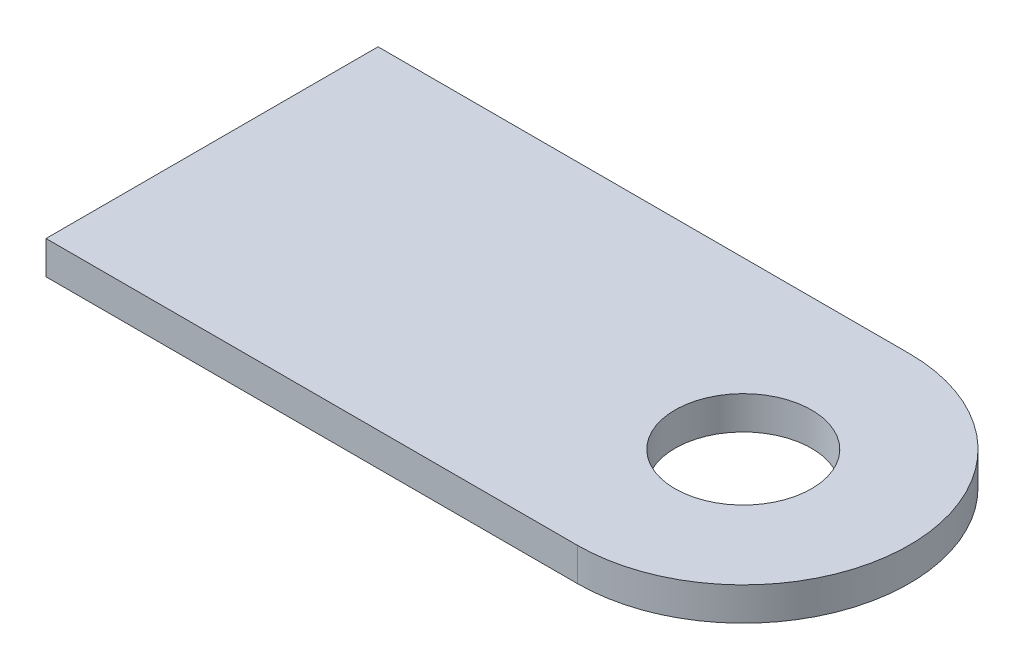
ISO-10303-21;
HEADER;
FILE_DESCRIPTION(('STEP AP214'),'2;1');
FILE_NAME('part.step','',(''),(''),'','','');
FILE_SCHEMA(('AUTOMOTIVE_DESIGN { 1 0 10303 214 1 1 1 1 }'));
ENDSEC;
DATA;
#1=APPLICATION_CONTEXT('core data for automotive mechanical design processes');
#2=APPLICATION_PROTOCOL_DEFINITION('international standard','automotive_design',2000,#1);
#3=PRODUCT_CONTEXT('',#1,'mechanical');
#4=PRODUCT('Part','Part','',(#3));
#5=PRODUCT_RELATED_PRODUCT_CATEGORY('part','',(#4));
#6=PRODUCT_DEFINITION_FORMATION('','',#4);
#7=PRODUCT_DEFINITION_CONTEXT('part definition',#1,'design');
#8=PRODUCT_DEFINITION('design','',#6,#7);
#9=PRODUCT_DEFINITION_SHAPE('','',#8);
#10=(LENGTH_UNIT() NAMED_UNIT(*) SI_UNIT(.MILLI.,.METRE.));
#11=(NAMED_UNIT(*) PLANE_ANGLE_UNIT() SI_UNIT($,.RADIAN.));
#12=(NAMED_UNIT(*) SI_UNIT($,.STERADIAN.) SOLID_ANGLE_UNIT());
#13=UNCERTAINTY_MEASURE_WITH_UNIT(LENGTH_MEASURE(1.E-05),#10,'distance_accuracy_value','');
#14=(GEOMETRIC_REPRESENTATION_CONTEXT(3) GLOBAL_UNCERTAINTY_ASSIGNED_CONTEXT((#13)) GLOBAL_UNIT_ASSIGNED_CONTEXT((#10,
#11,#12)) REPRESENTATION_CONTEXT('',''));
#15=CARTESIAN_POINT('',(0.,0.,0.));
#16=DIRECTION('',(0.,0.,1.));
#17=DIRECTION('',(1.,0.,0.));
#18=AXIS2_PLACEMENT_3D('',#15,#16,#17);
#19=CARTESIAN_POINT('',(25.4,1.5875,-7.9375));
#20=DIRECTION('',(0.,-1.,0.));
#21=DIRECTION('',(0.,0.,-1.));
#22=AXIS2_PLACEMENT_3D('',#19,#20,#21);
#23=PLANE('',#22);
#24=DIRECTION('',(1.,0.,0.));
#25=VECTOR('',#24,1.);
#26=CARTESIAN_POINT('',(0.,1.5875,0.));
#27=LINE('',#26,#25);
#28=CARTESIAN_POINT('',(0.,1.5875,0.));
#29=VERTEX_POINT('',#28);
#30=CARTESIAN_POINT('',(25.4,1.5875,0.));
#31=VERTEX_POINT('',#30);
#32=EDGE_CURVE('E91',#29,#31,#27,.T.);
#33=ORIENTED_EDGE('',*,*,#32,.T.);
#34=CARTESIAN_POINT('',(25.4,1.5875,-7.9375));
#35=DIRECTION('',(0.,1.,0.));
#36=DIRECTION('',(0.,0.,-1.));
#37=AXIS2_PLACEMENT_3D('',#34,#35,#36);
#38=CIRCLE('',#37,7.9375);
#39=CARTESIAN_POINT('',(25.4,1.5875,-15.875));
#40=VERTEX_POINT('',#39);
#41=EDGE_CURVE('E86',#31,#40,#38,.T.);
#42=ORIENTED_EDGE('',*,*,#41,.T.);
#43=DIRECTION('',(-1.,0.,0.));
#44=VECTOR('',#43,1.);
#45=CARTESIAN_POINT('',(0.,1.5875,-15.875));
#46=LINE('',#45,#44);
#47=CARTESIAN_POINT('',(0.,1.5875,-15.875));
#48=VERTEX_POINT('',#47);
#49=EDGE_CURVE('E89',#40,#48,#46,.T.);
#50=ORIENTED_EDGE('',*,*,#49,.T.);
#51=DIRECTION('',(0.,0.,1.));
#52=VECTOR('',#51,1.);
#53=CARTESIAN_POINT('',(0.,1.5875,0.));
#54=LINE('',#53,#52);
#55=EDGE_CURVE('E56',#48,#29,#54,.T.);
#56=ORIENTED_EDGE('',*,*,#55,.T.);
#57=EDGE_LOOP('',(#33,#42,#50,#56));
#58=FACE_BOUND('',#57,.T.);
#59=CARTESIAN_POINT('',(25.4,1.5875,-7.9375));
#60=DIRECTION('',(0.,1.,0.));
#61=DIRECTION('',(0.,0.,1.));
#62=AXIS2_PLACEMENT_3D('',#59,#60,#61);
#63=CIRCLE('',#62,3.2639);
#64=CARTESIAN_POINT('',(25.4,1.5875,-4.6736));
#65=VERTEX_POINT('',#64);
#66=EDGE_CURVE('E106',#65,#65,#63,.T.);
#67=ORIENTED_EDGE('',*,*,#66,.F.);
#68=EDGE_LOOP('',(#67));
#69=FACE_BOUND('',#68,.T.);
#70=ADVANCED_FACE('F39',(#58,#69),#23,.F.);
#71=CARTESIAN_POINT('',(25.4,0.,-7.9375));
#72=DIRECTION('',(0.,-1.,0.));
#73=DIRECTION('',(0.,0.,-1.));
#74=AXIS2_PLACEMENT_3D('',#71,#72,#73);
#75=PLANE('',#74);
#76=DIRECTION('',(1.,0.,0.));
#77=VECTOR('',#76,1.);
#78=CARTESIAN_POINT('',(0.,0.,0.));
#79=LINE('',#78,#77);
#80=CARTESIAN_POINT('',(0.,0.,0.));
#81=VERTEX_POINT('',#80);
#82=CARTESIAN_POINT('',(25.4,0.,0.));
#83=VERTEX_POINT('',#82);
#84=EDGE_CURVE('E103',#81,#83,#79,.T.);
#85=ORIENTED_EDGE('',*,*,#84,.F.);
#86=DIRECTION('',(0.,0.,1.));
#87=VECTOR('',#86,1.);
#88=CARTESIAN_POINT('',(0.,0.,0.));
#89=LINE('',#88,#87);
#90=CARTESIAN_POINT('',(0.,0.,-15.875));
#91=VERTEX_POINT('',#90);
#92=EDGE_CURVE('E79',#91,#81,#89,.T.);
#93=ORIENTED_EDGE('',*,*,#92,.F.);
#94=DIRECTION('',(-1.,0.,0.));
#95=VECTOR('',#94,1.);
#96=CARTESIAN_POINT('',(0.,0.,-15.875));
#97=LINE('',#96,#95);
#98=CARTESIAN_POINT('',(25.4,0.,-15.875));
#99=VERTEX_POINT('',#98);
#100=EDGE_CURVE('E73',#99,#91,#97,.T.);
#101=ORIENTED_EDGE('',*,*,#100,.F.);
#102=CARTESIAN_POINT('',(25.4,0.,-7.9375));
#103=DIRECTION('',(0.,1.,0.));
#104=DIRECTION('',(0.,0.,-1.));
#105=AXIS2_PLACEMENT_3D('',#102,#103,#104);
#106=CIRCLE('',#105,7.9375);
#107=EDGE_CURVE('E95',#83,#99,#106,.T.);
#108=ORIENTED_EDGE('',*,*,#107,.F.);
#109=EDGE_LOOP('',(#85,#93,#101,#108));
#110=FACE_BOUND('',#109,.T.);
#111=CARTESIAN_POINT('',(25.4,0.,-7.9375));
#112=DIRECTION('',(0.,1.,0.));
#113=DIRECTION('',(0.,0.,1.));
#114=AXIS2_PLACEMENT_3D('',#111,#112,#113);
#115=CIRCLE('',#114,3.2639);
#116=CARTESIAN_POINT('',(25.4,0.,-4.6736));
#117=VERTEX_POINT('',#116);
#118=EDGE_CURVE('E118',#117,#117,#115,.T.);
#119=ORIENTED_EDGE('',*,*,#118,.T.);
#120=EDGE_LOOP('',(#119));
#121=FACE_BOUND('',#120,.T.);
#122=ADVANCED_FACE('F114',(#110,#121),#75,.T.);
#123=CARTESIAN_POINT('',(0.,1.5875,0.));
#124=DIRECTION('',(0.,0.,-1.));
#125=DIRECTION('',(-1.,0.,0.));
#126=AXIS2_PLACEMENT_3D('',#123,#124,#125);
#127=PLANE('',#126);
#128=ORIENTED_EDGE('',*,*,#84,.T.);
#129=DIRECTION('',(0.,-1.,0.));
#130=VECTOR('',#129,1.);
#131=CARTESIAN_POINT('',(25.4,1.5875,0.));
#132=LINE('',#131,#130);
#133=EDGE_CURVE('E11',#31,#83,#132,.T.);
#134=ORIENTED_EDGE('',*,*,#133,.F.);
#135=ORIENTED_EDGE('',*,*,#32,.F.);
#136=DIRECTION('',(0.,-1.,0.));
#137=VECTOR('',#136,1.);
#138=CARTESIAN_POINT('',(0.,1.5875,0.));
#139=LINE('',#138,#137);
#140=EDGE_CURVE('E99',#29,#81,#139,.T.);
#141=ORIENTED_EDGE('',*,*,#140,.T.);
#142=EDGE_LOOP('',(#128,#134,#135,#141));
#143=FACE_BOUND('',#142,.T.);
#144=ADVANCED_FACE('F41',(#143),#127,.F.);
#145=CARTESIAN_POINT('',(25.4,1.5875,-7.9375));
#146=DIRECTION('',(0.,-1.,0.));
#147=DIRECTION('',(0.,0.,-1.));
#148=AXIS2_PLACEMENT_3D('',#145,#146,#147);
#149=CYLINDRICAL_SURFACE('',#148,7.9375);
#150=ORIENTED_EDGE('',*,*,#107,.T.);
#151=DIRECTION('',(0.,-1.,0.));
#152=VECTOR('',#151,1.);
#153=CARTESIAN_POINT('',(25.4,1.5875,-15.875));
#154=LINE('',#153,#152);
#155=EDGE_CURVE('E48',#40,#99,#154,.T.);
#156=ORIENTED_EDGE('',*,*,#155,.F.);
#157=ORIENTED_EDGE('',*,*,#41,.F.);
#158=ORIENTED_EDGE('',*,*,#133,.T.);
#159=EDGE_LOOP('',(#150,#156,#157,#158));
#160=FACE_BOUND('',#159,.T.);
#161=ADVANCED_FACE('F94',(#160),#149,.T.);
#162=CARTESIAN_POINT('',(0.,1.5875,-15.875));
#163=DIRECTION('',(0.,0.,1.));
#164=DIRECTION('',(1.,0.,0.));
#165=AXIS2_PLACEMENT_3D('',#162,#163,#164);
#166=PLANE('',#165);
#167=ORIENTED_EDGE('',*,*,#100,.T.);
#168=DIRECTION('',(0.,-1.,0.));
#169=VECTOR('',#168,1.);
#170=CARTESIAN_POINT('',(0.,1.5875,-15.875));
#171=LINE('',#170,#169);
#172=EDGE_CURVE('E96',#48,#91,#171,.T.);
#173=ORIENTED_EDGE('',*,*,#172,.F.);
#174=ORIENTED_EDGE('',*,*,#49,.F.);
#175=ORIENTED_EDGE('',*,*,#155,.T.);
#176=EDGE_LOOP('',(#167,#173,#174,#175));
#177=FACE_BOUND('',#176,.T.);
#178=ADVANCED_FACE('F97',(#177),#166,.F.);
#179=CARTESIAN_POINT('',(0.,1.5875,0.));
#180=DIRECTION('',(1.,0.,0.));
#181=DIRECTION('',(0.,0.,-1.));
#182=AXIS2_PLACEMENT_3D('',#179,#180,#181);
#183=PLANE('',#182);
#184=ORIENTED_EDGE('',*,*,#92,.T.);
#185=ORIENTED_EDGE('',*,*,#140,.F.);
#186=ORIENTED_EDGE('',*,*,#55,.F.);
#187=ORIENTED_EDGE('',*,*,#172,.T.);
#188=EDGE_LOOP('',(#184,#185,#186,#187));
#189=FACE_BOUND('',#188,.T.);
#190=ADVANCED_FACE('F111',(#189),#183,.F.);
#191=CARTESIAN_POINT('',(25.4,1.5875,-7.9375));
#192=DIRECTION('',(0.,-1.,0.));
#193=DIRECTION('',(0.,0.,-1.));
#194=AXIS2_PLACEMENT_3D('',#191,#192,#193);
#195=CYLINDRICAL_SURFACE('',#194,3.2639);
#196=ORIENTED_EDGE('',*,*,#66,.T.);
#197=EDGE_LOOP('',(#196));
#198=FACE_BOUND('',#197,.T.);
#199=ORIENTED_EDGE('',*,*,#118,.F.);
#200=EDGE_LOOP('',(#199));
#201=FACE_BOUND('',#200,.T.);
#202=ADVANCED_FACE('F124',(#198,#201),#195,.F.);
#203=CLOSED_SHELL('',(#70,#122,#144,#161,#178,#190,#202));
#204=MANIFOLD_SOLID_BREP('B2',#203);
#205=ADVANCED_BREP_SHAPE_REPRESENTATION('',(#18,#204),#14);
#206=SHAPE_DEFINITION_REPRESENTATION(#9,#205);
ENDSEC;
END-ISO-10303-21;
